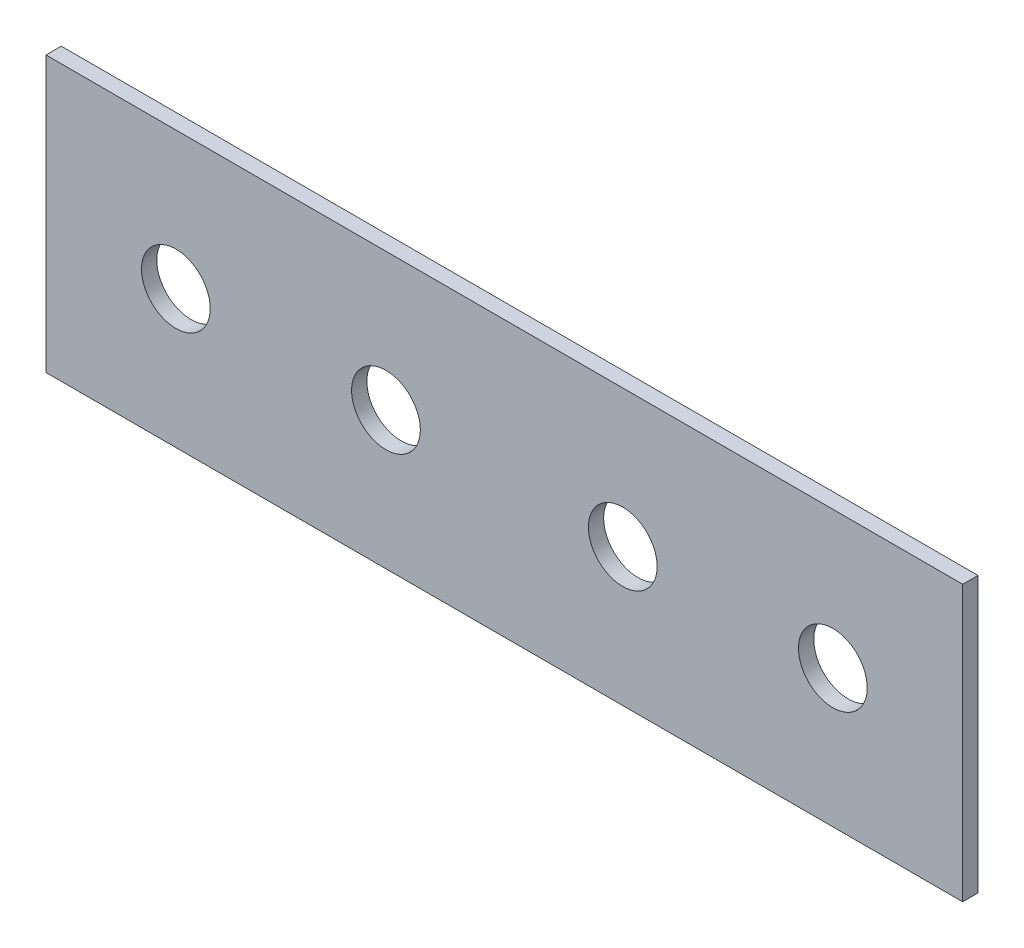
ISO-10303-21;
HEADER;
FILE_DESCRIPTION(('STEP AP214'),'2;1');
FILE_NAME('part.step','',(''),(''),'','','');
FILE_SCHEMA(('AUTOMOTIVE_DESIGN { 1 0 10303 214 1 1 1 1 }'));
ENDSEC;
DATA;
#1=APPLICATION_CONTEXT('core data for automotive mechanical design processes');
#2=APPLICATION_PROTOCOL_DEFINITION('international standard','automotive_design',2000,#1);
#3=PRODUCT_CONTEXT('',#1,'mechanical');
#4=PRODUCT('Part','Part','',(#3));
#5=PRODUCT_RELATED_PRODUCT_CATEGORY('part','',(#4));
#6=PRODUCT_DEFINITION_FORMATION('','',#4);
#7=PRODUCT_DEFINITION_CONTEXT('part definition',#1,'design');
#8=PRODUCT_DEFINITION('design','',#6,#7);
#9=PRODUCT_DEFINITION_SHAPE('','',#8);
#10=(LENGTH_UNIT() NAMED_UNIT(*) SI_UNIT(.MILLI.,.METRE.));
#11=(NAMED_UNIT(*) PLANE_ANGLE_UNIT() SI_UNIT($,.RADIAN.));
#12=(NAMED_UNIT(*) SI_UNIT($,.STERADIAN.) SOLID_ANGLE_UNIT());
#13=UNCERTAINTY_MEASURE_WITH_UNIT(LENGTH_MEASURE(1.E-05),#10,'distance_accuracy_value','');
#14=(GEOMETRIC_REPRESENTATION_CONTEXT(3) GLOBAL_UNCERTAINTY_ASSIGNED_CONTEXT((#13)) GLOBAL_UNIT_ASSIGNED_CONTEXT((#10,
#11,#12)) REPRESENTATION_CONTEXT('',''));
#15=CARTESIAN_POINT('',(0.,0.,0.));
#16=DIRECTION('',(0.,0.,1.));
#17=DIRECTION('',(1.,0.,0.));
#18=AXIS2_PLACEMENT_3D('',#15,#16,#17);
#19=CARTESIAN_POINT('',(0.,0.,2.));
#20=DIRECTION('',(0.,0.,-1.));
#21=DIRECTION('',(-1.,0.,0.));
#22=AXIS2_PLACEMENT_3D('',#19,#20,#21);
#23=PLANE('',#22);
#24=CARTESIAN_POINT('',(75.4999999999999,18.,2.));
#25=DIRECTION('',(0.,0.,1.));
#26=DIRECTION('',(1.,0.,0.));
#27=AXIS2_PLACEMENT_3D('',#24,#25,#26);
#28=CIRCLE('',#27,4.5);
#29=CARTESIAN_POINT('',(79.9999999999999,18.,2.));
#30=VERTEX_POINT('',#29);
#31=EDGE_CURVE('E123',#30,#30,#28,.T.);
#32=ORIENTED_EDGE('',*,*,#31,.F.);
#33=EDGE_LOOP('',(#32));
#34=FACE_BOUND('',#33,.T.);
#35=CARTESIAN_POINT('',(16.9999999999999,18.,2.));
#36=DIRECTION('',(0.,0.,1.));
#37=DIRECTION('',(1.,0.,0.));
#38=AXIS2_PLACEMENT_3D('',#35,#36,#37);
#39=CIRCLE('',#38,4.5);
#40=CARTESIAN_POINT('',(21.4999999999999,18.,2.));
#41=VERTEX_POINT('',#40);
#42=EDGE_CURVE('E102',#41,#41,#39,.T.);
#43=ORIENTED_EDGE('',*,*,#42,.F.);
#44=EDGE_LOOP('',(#43));
#45=FACE_BOUND('',#44,.T.);
#46=DIRECTION('',(1.,0.,0.));
#47=VECTOR('',#46,1.);
#48=CARTESIAN_POINT('',(0.,0.,2.));
#49=LINE('',#48,#47);
#50=CARTESIAN_POINT('',(0.,0.,2.));
#51=VERTEX_POINT('',#50);
#52=CARTESIAN_POINT('',(120.,0.,2.));
#53=VERTEX_POINT('',#52);
#54=EDGE_CURVE('E87',#51,#53,#49,.T.);
#55=ORIENTED_EDGE('',*,*,#54,.T.);
#56=DIRECTION('',(0.,1.,0.));
#57=VECTOR('',#56,1.);
#58=CARTESIAN_POINT('',(120.,36.,2.));
#59=LINE('',#58,#57);
#60=CARTESIAN_POINT('',(120.,36.,2.));
#61=VERTEX_POINT('',#60);
#62=EDGE_CURVE('E82',#53,#61,#59,.T.);
#63=ORIENTED_EDGE('',*,*,#62,.T.);
#64=DIRECTION('',(-1.,0.,0.));
#65=VECTOR('',#64,1.);
#66=CARTESIAN_POINT('',(0.,36.,2.));
#67=LINE('',#66,#65);
#68=CARTESIAN_POINT('',(0.,36.,2.));
#69=VERTEX_POINT('',#68);
#70=EDGE_CURVE('E85',#61,#69,#67,.T.);
#71=ORIENTED_EDGE('',*,*,#70,.T.);
#72=DIRECTION('',(0.,-1.,0.));
#73=VECTOR('',#72,1.);
#74=CARTESIAN_POINT('',(0.,0.,2.));
#75=LINE('',#74,#73);
#76=EDGE_CURVE('E52',#69,#51,#75,.T.);
#77=ORIENTED_EDGE('',*,*,#76,.T.);
#78=EDGE_LOOP('',(#55,#63,#71,#77));
#79=FACE_BOUND('',#78,.T.);
#80=CARTESIAN_POINT('',(44.4999999999999,18.,2.));
#81=DIRECTION('',(0.,0.,1.));
#82=DIRECTION('',(1.,0.,0.));
#83=AXIS2_PLACEMENT_3D('',#80,#81,#82);
#84=CIRCLE('',#83,4.5);
#85=CARTESIAN_POINT('',(48.9999999999999,18.,2.));
#86=VERTEX_POINT('',#85);
#87=EDGE_CURVE('E117',#86,#86,#84,.T.);
#88=ORIENTED_EDGE('',*,*,#87,.F.);
#89=EDGE_LOOP('',(#88));
#90=FACE_BOUND('',#89,.T.);
#91=CARTESIAN_POINT('',(103.,18.,2.));
#92=DIRECTION('',(0.,0.,1.));
#93=DIRECTION('',(1.,0.,0.));
#94=AXIS2_PLACEMENT_3D('',#91,#92,#93);
#95=CIRCLE('',#94,4.5);
#96=CARTESIAN_POINT('',(107.5,18.,2.));
#97=VERTEX_POINT('',#96);
#98=EDGE_CURVE('E129',#97,#97,#95,.T.);
#99=ORIENTED_EDGE('',*,*,#98,.F.);
#100=EDGE_LOOP('',(#99));
#101=FACE_BOUND('',#100,.T.);
#102=ADVANCED_FACE('F35',(#34,#45,#79,#90,#101),#23,.F.);
#103=CARTESIAN_POINT('',(0.,0.,0.));
#104=DIRECTION('',(0.,0.,-1.));
#105=DIRECTION('',(-1.,0.,0.));
#106=AXIS2_PLACEMENT_3D('',#103,#104,#105);
#107=PLANE('',#106);
#108=CARTESIAN_POINT('',(75.4999999999999,18.,0.));
#109=DIRECTION('',(0.,0.,1.));
#110=DIRECTION('',(1.,0.,0.));
#111=AXIS2_PLACEMENT_3D('',#108,#109,#110);
#112=CIRCLE('',#111,4.5);
#113=CARTESIAN_POINT('',(79.9999999999999,18.,0.));
#114=VERTEX_POINT('',#113);
#115=EDGE_CURVE('E126',#114,#114,#112,.T.);
#116=ORIENTED_EDGE('',*,*,#115,.T.);
#117=EDGE_LOOP('',(#116));
#118=FACE_BOUND('',#117,.T.);
#119=CARTESIAN_POINT('',(16.9999999999999,18.,0.));
#120=DIRECTION('',(0.,0.,1.));
#121=DIRECTION('',(1.,0.,0.));
#122=AXIS2_PLACEMENT_3D('',#119,#120,#121);
#123=CIRCLE('',#122,4.5);
#124=CARTESIAN_POINT('',(21.4999999999999,18.,0.));
#125=VERTEX_POINT('',#124);
#126=EDGE_CURVE('E114',#125,#125,#123,.T.);
#127=ORIENTED_EDGE('',*,*,#126,.T.);
#128=EDGE_LOOP('',(#127));
#129=FACE_BOUND('',#128,.T.);
#130=DIRECTION('',(1.,0.,0.));
#131=VECTOR('',#130,1.);
#132=CARTESIAN_POINT('',(0.,0.,0.));
#133=LINE('',#132,#131);
#134=CARTESIAN_POINT('',(0.,0.,0.));
#135=VERTEX_POINT('',#134);
#136=CARTESIAN_POINT('',(120.,0.,0.));
#137=VERTEX_POINT('',#136);
#138=EDGE_CURVE('E99',#135,#137,#133,.T.);
#139=ORIENTED_EDGE('',*,*,#138,.F.);
#140=DIRECTION('',(0.,-1.,0.));
#141=VECTOR('',#140,1.);
#142=CARTESIAN_POINT('',(0.,0.,0.));
#143=LINE('',#142,#141);
#144=CARTESIAN_POINT('',(0.,36.,0.));
#145=VERTEX_POINT('',#144);
#146=EDGE_CURVE('E75',#145,#135,#143,.T.);
#147=ORIENTED_EDGE('',*,*,#146,.F.);
#148=DIRECTION('',(-1.,0.,0.));
#149=VECTOR('',#148,1.);
#150=CARTESIAN_POINT('',(0.,36.,0.));
#151=LINE('',#150,#149);
#152=CARTESIAN_POINT('',(120.,36.,0.));
#153=VERTEX_POINT('',#152);
#154=EDGE_CURVE('E69',#153,#145,#151,.T.);
#155=ORIENTED_EDGE('',*,*,#154,.F.);
#156=DIRECTION('',(0.,1.,0.));
#157=VECTOR('',#156,1.);
#158=CARTESIAN_POINT('',(120.,36.,0.));
#159=LINE('',#158,#157);
#160=EDGE_CURVE('E91',#137,#153,#159,.T.);
#161=ORIENTED_EDGE('',*,*,#160,.F.);
#162=EDGE_LOOP('',(#139,#147,#155,#161));
#163=FACE_BOUND('',#162,.T.);
#164=CARTESIAN_POINT('',(44.4999999999999,18.,0.));
#165=DIRECTION('',(0.,0.,1.));
#166=DIRECTION('',(1.,0.,0.));
#167=AXIS2_PLACEMENT_3D('',#164,#165,#166);
#168=CIRCLE('',#167,4.5);
#169=CARTESIAN_POINT('',(48.9999999999999,18.,0.));
#170=VERTEX_POINT('',#169);
#171=EDGE_CURVE('E120',#170,#170,#168,.T.);
#172=ORIENTED_EDGE('',*,*,#171,.T.);
#173=EDGE_LOOP('',(#172));
#174=FACE_BOUND('',#173,.T.);
#175=CARTESIAN_POINT('',(103.,18.,0.));
#176=DIRECTION('',(0.,0.,1.));
#177=DIRECTION('',(1.,0.,0.));
#178=AXIS2_PLACEMENT_3D('',#175,#176,#177);
#179=CIRCLE('',#178,4.5);
#180=CARTESIAN_POINT('',(107.5,18.,0.));
#181=VERTEX_POINT('',#180);
#182=EDGE_CURVE('E132',#181,#181,#179,.T.);
#183=ORIENTED_EDGE('',*,*,#182,.T.);
#184=EDGE_LOOP('',(#183));
#185=FACE_BOUND('',#184,.T.);
#186=ADVANCED_FACE('F110',(#118,#129,#163,#174,#185),#107,.T.);
#187=CARTESIAN_POINT('',(0.,0.,2.));
#188=DIRECTION('',(0.,1.,0.));
#189=DIRECTION('',(0.,0.,1.));
#190=AXIS2_PLACEMENT_3D('',#187,#188,#189);
#191=PLANE('',#190);
#192=ORIENTED_EDGE('',*,*,#138,.T.);
#193=DIRECTION('',(0.,0.,-1.));
#194=VECTOR('',#193,1.);
#195=CARTESIAN_POINT('',(120.,0.,2.));
#196=LINE('',#195,#194);
#197=EDGE_CURVE('E11',#53,#137,#196,.T.);
#198=ORIENTED_EDGE('',*,*,#197,.F.);
#199=ORIENTED_EDGE('',*,*,#54,.F.);
#200=DIRECTION('',(0.,0.,-1.));
#201=VECTOR('',#200,1.);
#202=CARTESIAN_POINT('',(0.,0.,2.));
#203=LINE('',#202,#201);
#204=EDGE_CURVE('E95',#51,#135,#203,.T.);
#205=ORIENTED_EDGE('',*,*,#204,.T.);
#206=EDGE_LOOP('',(#192,#198,#199,#205));
#207=FACE_BOUND('',#206,.T.);
#208=ADVANCED_FACE('F37',(#207),#191,.F.);
#209=CARTESIAN_POINT('',(120.,36.,2.));
#210=DIRECTION('',(-1.,0.,0.));
#211=DIRECTION('',(0.,0.,1.));
#212=AXIS2_PLACEMENT_3D('',#209,#210,#211);
#213=PLANE('',#212);
#214=ORIENTED_EDGE('',*,*,#160,.T.);
#215=DIRECTION('',(0.,0.,-1.));
#216=VECTOR('',#215,1.);
#217=CARTESIAN_POINT('',(120.,36.,2.));
#218=LINE('',#217,#216);
#219=EDGE_CURVE('E44',#61,#153,#218,.T.);
#220=ORIENTED_EDGE('',*,*,#219,.F.);
#221=ORIENTED_EDGE('',*,*,#62,.F.);
#222=ORIENTED_EDGE('',*,*,#197,.T.);
#223=EDGE_LOOP('',(#214,#220,#221,#222));
#224=FACE_BOUND('',#223,.T.);
#225=ADVANCED_FACE('F90',(#224),#213,.F.);
#226=CARTESIAN_POINT('',(0.,36.,2.));
#227=DIRECTION('',(0.,-1.,0.));
#228=DIRECTION('',(0.,0.,-1.));
#229=AXIS2_PLACEMENT_3D('',#226,#227,#228);
#230=PLANE('',#229);
#231=ORIENTED_EDGE('',*,*,#154,.T.);
#232=DIRECTION('',(0.,0.,-1.));
#233=VECTOR('',#232,1.);
#234=CARTESIAN_POINT('',(0.,36.,2.));
#235=LINE('',#234,#233);
#236=EDGE_CURVE('E92',#69,#145,#235,.T.);
#237=ORIENTED_EDGE('',*,*,#236,.F.);
#238=ORIENTED_EDGE('',*,*,#70,.F.);
#239=ORIENTED_EDGE('',*,*,#219,.T.);
#240=EDGE_LOOP('',(#231,#237,#238,#239));
#241=FACE_BOUND('',#240,.T.);
#242=ADVANCED_FACE('F93',(#241),#230,.F.);
#243=CARTESIAN_POINT('',(0.,0.,2.));
#244=DIRECTION('',(1.,0.,0.));
#245=DIRECTION('',(0.,0.,-1.));
#246=AXIS2_PLACEMENT_3D('',#243,#244,#245);
#247=PLANE('',#246);
#248=ORIENTED_EDGE('',*,*,#146,.T.);
#249=ORIENTED_EDGE('',*,*,#204,.F.);
#250=ORIENTED_EDGE('',*,*,#76,.F.);
#251=ORIENTED_EDGE('',*,*,#236,.T.);
#252=EDGE_LOOP('',(#248,#249,#250,#251));
#253=FACE_BOUND('',#252,.T.);
#254=ADVANCED_FACE('F107',(#253),#247,.F.);
#255=CARTESIAN_POINT('',(16.9999999999999,18.,2.));
#256=DIRECTION('',(0.,0.,-1.));
#257=DIRECTION('',(-1.,0.,0.));
#258=AXIS2_PLACEMENT_3D('',#255,#256,#257);
#259=CYLINDRICAL_SURFACE('',#258,4.5);
#260=ORIENTED_EDGE('',*,*,#42,.T.);
#261=EDGE_LOOP('',(#260));
#262=FACE_BOUND('',#261,.T.);
#263=ORIENTED_EDGE('',*,*,#126,.F.);
#264=EDGE_LOOP('',(#263));
#265=FACE_BOUND('',#264,.T.);
#266=ADVANCED_FACE('F152',(#262,#265),#259,.F.);
#267=CARTESIAN_POINT('',(44.4999999999999,18.,2.));
#268=DIRECTION('',(0.,0.,-1.));
#269=DIRECTION('',(-1.,0.,0.));
#270=AXIS2_PLACEMENT_3D('',#267,#268,#269);
#271=CYLINDRICAL_SURFACE('',#270,4.5);
#272=ORIENTED_EDGE('',*,*,#87,.T.);
#273=EDGE_LOOP('',(#272));
#274=FACE_BOUND('',#273,.T.);
#275=ORIENTED_EDGE('',*,*,#171,.F.);
#276=EDGE_LOOP('',(#275));
#277=FACE_BOUND('',#276,.T.);
#278=ADVANCED_FACE('F198',(#274,#277),#271,.F.);
#279=CARTESIAN_POINT('',(75.4999999999999,18.,2.));
#280=DIRECTION('',(0.,0.,-1.));
#281=DIRECTION('',(-1.,0.,0.));
#282=AXIS2_PLACEMENT_3D('',#279,#280,#281);
#283=CYLINDRICAL_SURFACE('',#282,4.5);
#284=ORIENTED_EDGE('',*,*,#31,.T.);
#285=EDGE_LOOP('',(#284));
#286=FACE_BOUND('',#285,.T.);
#287=ORIENTED_EDGE('',*,*,#115,.F.);
#288=EDGE_LOOP('',(#287));
#289=FACE_BOUND('',#288,.T.);
#290=ADVANCED_FACE('F206',(#286,#289),#283,.F.);
#291=CARTESIAN_POINT('',(103.,18.,2.));
#292=DIRECTION('',(0.,0.,-1.));
#293=DIRECTION('',(-1.,0.,0.));
#294=AXIS2_PLACEMENT_3D('',#291,#292,#293);
#295=CYLINDRICAL_SURFACE('',#294,4.5);
#296=ORIENTED_EDGE('',*,*,#98,.T.);
#297=EDGE_LOOP('',(#296));
#298=FACE_BOUND('',#297,.T.);
#299=ORIENTED_EDGE('',*,*,#182,.F.);
#300=EDGE_LOOP('',(#299));
#301=FACE_BOUND('',#300,.T.);
#302=ADVANCED_FACE('F138',(#298,#301),#295,.F.);
#303=CLOSED_SHELL('',(#102,#186,#208,#225,#242,#254,#266,#278,#290,#302));
#304=MANIFOLD_SOLID_BREP('B2',#303);
#305=ADVANCED_BREP_SHAPE_REPRESENTATION('',(#18,#304),#14);
#306=SHAPE_DEFINITION_REPRESENTATION(#9,#305);
ENDSEC;
END-ISO-10303-21;
